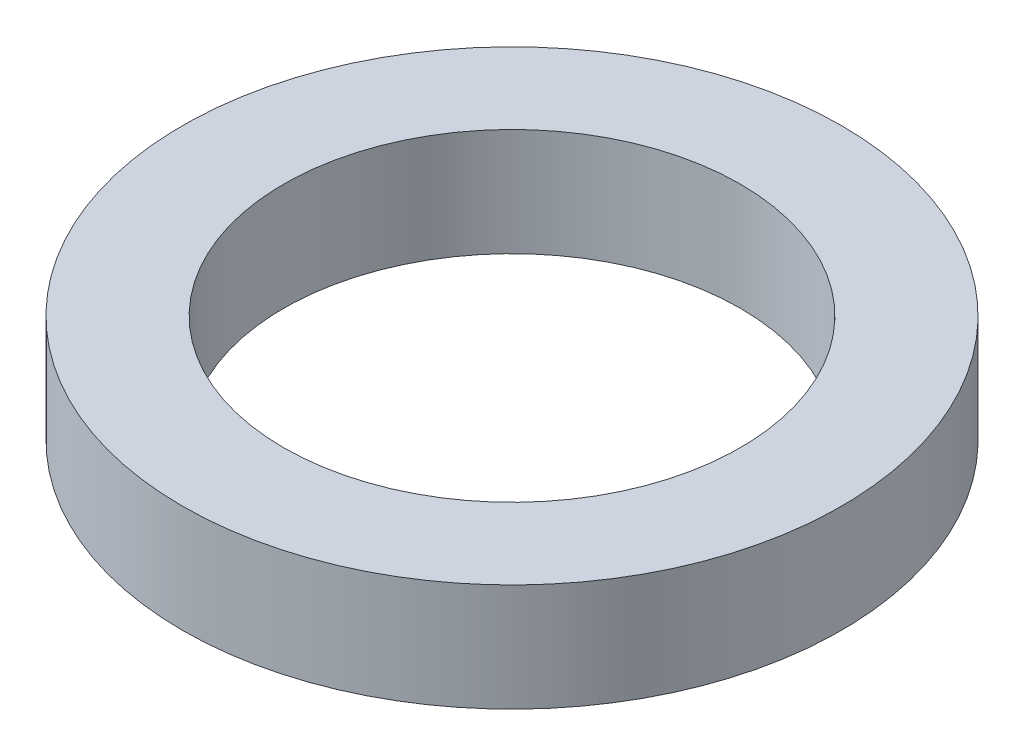
ISO-10303-21;
HEADER;
FILE_DESCRIPTION(('STEP AP214'),'2;1');
FILE_NAME('part.step','',(''),(''),'','','');
FILE_SCHEMA(('AUTOMOTIVE_DESIGN { 1 0 10303 214 1 1 1 1 }'));
ENDSEC;
DATA;
#1=APPLICATION_CONTEXT('core data for automotive mechanical design processes');
#2=APPLICATION_PROTOCOL_DEFINITION('international standard','automotive_design',2000,#1);
#3=PRODUCT_CONTEXT('',#1,'mechanical');
#4=PRODUCT('Part','Part','',(#3));
#5=PRODUCT_RELATED_PRODUCT_CATEGORY('part','',(#4));
#6=PRODUCT_DEFINITION_FORMATION('','',#4);
#7=PRODUCT_DEFINITION_CONTEXT('part definition',#1,'design');
#8=PRODUCT_DEFINITION('design','',#6,#7);
#9=PRODUCT_DEFINITION_SHAPE('','',#8);
#10=(LENGTH_UNIT() NAMED_UNIT(*) SI_UNIT(.MILLI.,.METRE.));
#11=(NAMED_UNIT(*) PLANE_ANGLE_UNIT() SI_UNIT($,.RADIAN.));
#12=(NAMED_UNIT(*) SI_UNIT($,.STERADIAN.) SOLID_ANGLE_UNIT());
#13=UNCERTAINTY_MEASURE_WITH_UNIT(LENGTH_MEASURE(1.E-05),#10,'distance_accuracy_value','');
#14=(GEOMETRIC_REPRESENTATION_CONTEXT(3) GLOBAL_UNCERTAINTY_ASSIGNED_CONTEXT((#13)) GLOBAL_UNIT_ASSIGNED_CONTEXT((#10,
#11,#12)) REPRESENTATION_CONTEXT('',''));
#15=CARTESIAN_POINT('',(0.,0.,0.));
#16=DIRECTION('',(0.,0.,1.));
#17=DIRECTION('',(1.,0.,0.));
#18=AXIS2_PLACEMENT_3D('',#15,#16,#17);
#19=CARTESIAN_POINT('',(0.,0.,0.));
#20=DIRECTION('',(0.,1.,0.));
#21=DIRECTION('',(0.,0.,1.));
#22=AXIS2_PLACEMENT_3D('',#19,#20,#21);
#23=PLANE('',#22);
#24=CARTESIAN_POINT('',(0.,0.,0.));
#25=DIRECTION('',(0.,-1.,0.));
#26=DIRECTION('',(0.,0.,-1.));
#27=AXIS2_PLACEMENT_3D('',#24,#25,#26);
#28=CIRCLE('',#27,7.9375);
#29=CARTESIAN_POINT('',(0.,0.,-7.9375));
#30=VERTEX_POINT('',#29);
#31=EDGE_CURVE('E27',#30,#30,#28,.F.);
#32=ORIENTED_EDGE('',*,*,#31,.F.);
#33=EDGE_LOOP('',(#32));
#34=FACE_BOUND('',#33,.T.);
#35=CARTESIAN_POINT('',(0.,0.,0.));
#36=DIRECTION('',(0.,-1.,0.));
#37=DIRECTION('',(0.,0.,-1.));
#38=AXIS2_PLACEMENT_3D('',#35,#36,#37);
#39=CIRCLE('',#38,5.49926131403117);
#40=CARTESIAN_POINT('',(0.,0.,-5.49926131403117));
#41=VERTEX_POINT('',#40);
#42=EDGE_CURVE('E18',#41,#41,#39,.F.);
#43=ORIENTED_EDGE('',*,*,#42,.T.);
#44=EDGE_LOOP('',(#43));
#45=FACE_BOUND('',#44,.T.);
#46=ADVANCED_FACE('F15',(#34,#45),#23,.F.);
#47=CARTESIAN_POINT('',(0.,2.5908,0.));
#48=DIRECTION('',(0.,-1.,0.));
#49=DIRECTION('',(0.,0.,-1.));
#50=AXIS2_PLACEMENT_3D('',#47,#48,#49);
#51=CYLINDRICAL_SURFACE('',#50,5.49926131403117);
#52=CARTESIAN_POINT('',(0.,2.5908,0.));
#53=DIRECTION('',(0.,-1.,0.));
#54=DIRECTION('',(0.,0.,-1.));
#55=AXIS2_PLACEMENT_3D('',#52,#53,#54);
#56=CIRCLE('',#55,5.49926131403117);
#57=CARTESIAN_POINT('',(0.,2.5908,-5.49926131403117));
#58=VERTEX_POINT('',#57);
#59=EDGE_CURVE('E22',#58,#58,#56,.T.);
#60=ORIENTED_EDGE('',*,*,#59,.F.);
#61=EDGE_LOOP('',(#60));
#62=FACE_BOUND('',#61,.T.);
#63=ORIENTED_EDGE('',*,*,#42,.F.);
#64=EDGE_LOOP('',(#63));
#65=FACE_BOUND('',#64,.T.);
#66=ADVANCED_FACE('F36',(#62,#65),#51,.F.);
#67=CARTESIAN_POINT('',(0.,2.5908,0.));
#68=DIRECTION('',(0.,-1.,0.));
#69=DIRECTION('',(0.,0.,-1.));
#70=AXIS2_PLACEMENT_3D('',#67,#68,#69);
#71=CYLINDRICAL_SURFACE('',#70,7.9375);
#72=ORIENTED_EDGE('',*,*,#31,.T.);
#73=EDGE_LOOP('',(#72));
#74=FACE_BOUND('',#73,.T.);
#75=CARTESIAN_POINT('',(0.,2.5908,0.));
#76=DIRECTION('',(0.,-1.,0.));
#77=DIRECTION('',(0.,0.,-1.));
#78=AXIS2_PLACEMENT_3D('',#75,#76,#77);
#79=CIRCLE('',#78,7.9375);
#80=CARTESIAN_POINT('',(0.,2.5908,-7.9375));
#81=VERTEX_POINT('',#80);
#82=EDGE_CURVE('E10',#81,#81,#79,.F.);
#83=ORIENTED_EDGE('',*,*,#82,.F.);
#84=EDGE_LOOP('',(#83));
#85=FACE_BOUND('',#84,.T.);
#86=ADVANCED_FACE('F38',(#74,#85),#71,.T.);
#87=CARTESIAN_POINT('',(0.,2.5908,0.));
#88=DIRECTION('',(0.,1.,0.));
#89=DIRECTION('',(0.,0.,1.));
#90=AXIS2_PLACEMENT_3D('',#87,#88,#89);
#91=PLANE('',#90);
#92=ORIENTED_EDGE('',*,*,#82,.T.);
#93=EDGE_LOOP('',(#92));
#94=FACE_BOUND('',#93,.T.);
#95=ORIENTED_EDGE('',*,*,#59,.T.);
#96=EDGE_LOOP('',(#95));
#97=FACE_BOUND('',#96,.T.);
#98=ADVANCED_FACE('F45',(#94,#97),#91,.T.);
#99=CLOSED_SHELL('',(#46,#66,#86,#98));
#100=MANIFOLD_SOLID_BREP('B1',#99);
#101=ADVANCED_BREP_SHAPE_REPRESENTATION('',(#18,#100),#14);
#102=SHAPE_DEFINITION_REPRESENTATION(#9,#101);
ENDSEC;
END-ISO-10303-21;
